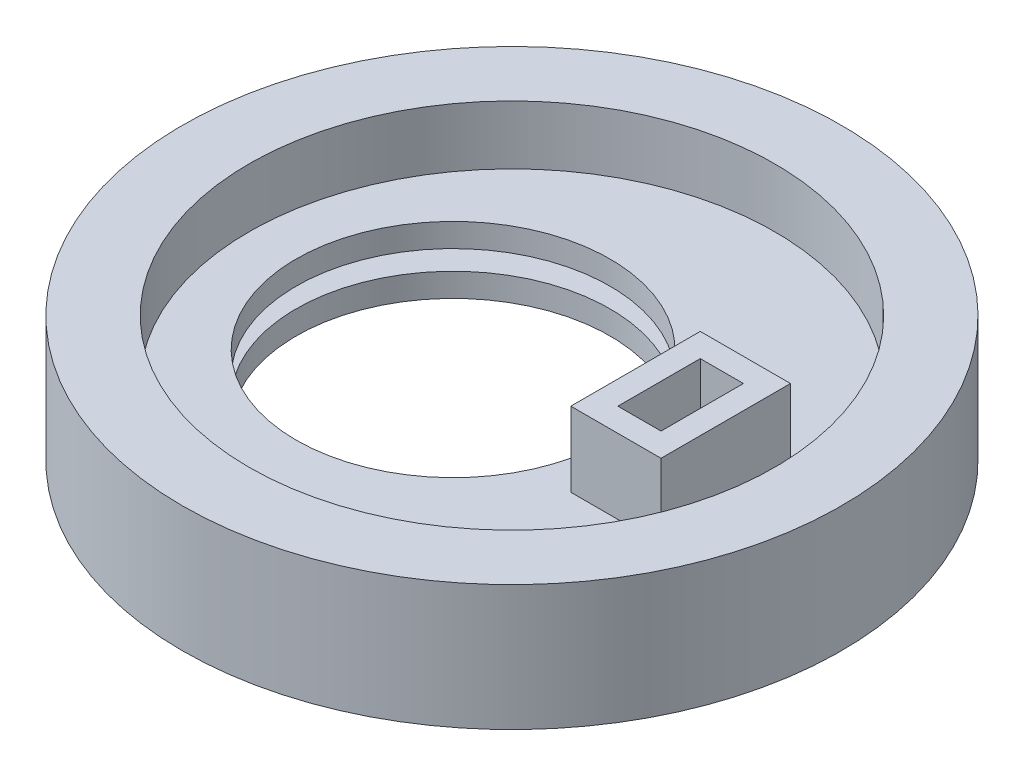
ISO-10303-21;
HEADER;
FILE_DESCRIPTION(('STEP AP214'),'2;1');
FILE_NAME('part.step','',(''),(''),'','','');
FILE_SCHEMA(('AUTOMOTIVE_DESIGN { 1 0 10303 214 1 1 1 1 }'));
ENDSEC;
DATA;
#1=APPLICATION_CONTEXT('core data for automotive mechanical design processes');
#2=APPLICATION_PROTOCOL_DEFINITION('international standard','automotive_design',2000,#1);
#3=PRODUCT_CONTEXT('',#1,'mechanical');
#4=PRODUCT('Part','Part','',(#3));
#5=PRODUCT_RELATED_PRODUCT_CATEGORY('part','',(#4));
#6=PRODUCT_DEFINITION_FORMATION('','',#4);
#7=PRODUCT_DEFINITION_CONTEXT('part definition',#1,'design');
#8=PRODUCT_DEFINITION('design','',#6,#7);
#9=PRODUCT_DEFINITION_SHAPE('','',#8);
#10=(LENGTH_UNIT() NAMED_UNIT(*) SI_UNIT(.MILLI.,.METRE.));
#11=(NAMED_UNIT(*) PLANE_ANGLE_UNIT() SI_UNIT($,.RADIAN.));
#12=(NAMED_UNIT(*) SI_UNIT($,.STERADIAN.) SOLID_ANGLE_UNIT());
#13=UNCERTAINTY_MEASURE_WITH_UNIT(LENGTH_MEASURE(1.E-05),#10,'distance_accuracy_value','');
#14=(GEOMETRIC_REPRESENTATION_CONTEXT(3) GLOBAL_UNCERTAINTY_ASSIGNED_CONTEXT((#13)) GLOBAL_UNIT_ASSIGNED_CONTEXT((#10,
#11,#12)) REPRESENTATION_CONTEXT('',''));
#15=CARTESIAN_POINT('',(0.,0.,0.));
#16=DIRECTION('',(0.,0.,1.));
#17=DIRECTION('',(1.,0.,0.));
#18=AXIS2_PLACEMENT_3D('',#15,#16,#17);
#19=CARTESIAN_POINT('',(0.,5.,0.));
#20=DIRECTION('',(0.,-1.,0.));
#21=DIRECTION('',(0.,0.,-1.));
#22=AXIS2_PLACEMENT_3D('',#19,#20,#21);
#23=PLANE('',#22);
#24=DIRECTION('',(0.,0.,-1.));
#25=VECTOR('',#24,1.);
#26=CARTESIAN_POINT('',(10.9,5.,0.));
#27=LINE('',#26,#25);
#28=CARTESIAN_POINT('',(10.9,5.,3.3));
#29=VERTEX_POINT('',#28);
#30=CARTESIAN_POINT('',(10.9,5.,-3.3));
#31=VERTEX_POINT('',#30);
#32=EDGE_CURVE('E111',#29,#31,#27,.T.);
#33=ORIENTED_EDGE('',*,*,#32,.T.);
#34=DIRECTION('',(-1.,0.,0.));
#35=VECTOR('',#34,1.);
#36=CARTESIAN_POINT('',(0.,5.,-3.3));
#37=LINE('',#36,#35);
#38=CARTESIAN_POINT('',(6.3,5.,-3.3));
#39=VERTEX_POINT('',#38);
#40=EDGE_CURVE('E89',#31,#39,#37,.T.);
#41=ORIENTED_EDGE('',*,*,#40,.T.);
#42=DIRECTION('',(0.,0.,1.));
#43=VECTOR('',#42,1.);
#44=CARTESIAN_POINT('',(6.3,5.,0.));
#45=LINE('',#44,#43);
#46=CARTESIAN_POINT('',(6.3,5.,3.3));
#47=VERTEX_POINT('',#46);
#48=EDGE_CURVE('E84',#39,#47,#45,.T.);
#49=ORIENTED_EDGE('',*,*,#48,.T.);
#50=DIRECTION('',(1.,0.,0.));
#51=VECTOR('',#50,1.);
#52=CARTESIAN_POINT('',(0.,5.,3.3));
#53=LINE('',#52,#51);
#54=EDGE_CURVE('E87',#47,#29,#53,.T.);
#55=ORIENTED_EDGE('',*,*,#54,.T.);
#56=EDGE_LOOP('',(#33,#41,#49,#55));
#57=FACE_BOUND('',#56,.T.);
#58=DIRECTION('',(0.,0.,-1.));
#59=VECTOR('',#58,1.);
#60=CARTESIAN_POINT('',(9.7,5.,-2.1));
#61=LINE('',#60,#59);
#62=CARTESIAN_POINT('',(9.7,5.,2.1));
#63=VERTEX_POINT('',#62);
#64=CARTESIAN_POINT('',(9.7,5.,-2.1));
#65=VERTEX_POINT('',#64);
#66=EDGE_CURVE('E179',#63,#65,#61,.T.);
#67=ORIENTED_EDGE('',*,*,#66,.F.);
#68=DIRECTION('',(1.,0.,0.));
#69=VECTOR('',#68,1.);
#70=CARTESIAN_POINT('',(9.7,5.,2.1));
#71=LINE('',#70,#69);
#72=CARTESIAN_POINT('',(7.5,5.,2.1));
#73=VERTEX_POINT('',#72);
#74=EDGE_CURVE('E174',#73,#63,#71,.T.);
#75=ORIENTED_EDGE('',*,*,#74,.F.);
#76=DIRECTION('',(0.,0.,1.));
#77=VECTOR('',#76,1.);
#78=CARTESIAN_POINT('',(7.5,5.,-2.1));
#79=LINE('',#78,#77);
#80=CARTESIAN_POINT('',(7.5,5.,-2.1));
#81=VERTEX_POINT('',#80);
#82=EDGE_CURVE('E195',#81,#73,#79,.T.);
#83=ORIENTED_EDGE('',*,*,#82,.F.);
#84=DIRECTION('',(-1.,0.,0.));
#85=VECTOR('',#84,1.);
#86=CARTESIAN_POINT('',(9.7,5.,-2.1));
#87=LINE('',#86,#85);
#88=EDGE_CURVE('E198',#65,#81,#87,.T.);
#89=ORIENTED_EDGE('',*,*,#88,.F.);
#90=EDGE_LOOP('',(#67,#75,#83,#89));
#91=FACE_BOUND('',#90,.T.);
#92=ADVANCED_FACE('F39',(#57,#91),#23,.F.);
#93=CARTESIAN_POINT('',(0.,1.2,0.));
#94=DIRECTION('',(0.,1.,0.));
#95=DIRECTION('',(0.,0.,1.));
#96=AXIS2_PLACEMENT_3D('',#93,#94,#95);
#97=PLANE('',#96);
#98=CARTESIAN_POINT('',(-3.,1.2,0.));
#99=DIRECTION('',(0.,1.,0.));
#100=DIRECTION('',(0.,0.,1.));
#101=AXIS2_PLACEMENT_3D('',#98,#99,#100);
#102=CIRCLE('',#101,8.);
#103=CARTESIAN_POINT('',(-3.,1.2,8.));
#104=VERTEX_POINT('',#103);
#105=EDGE_CURVE('E208',#104,#104,#102,.T.);
#106=ORIENTED_EDGE('',*,*,#105,.F.);
#107=EDGE_LOOP('',(#106));
#108=FACE_BOUND('',#107,.T.);
#109=CARTESIAN_POINT('',(0.,1.2,0.));
#110=DIRECTION('',(0.,1.,0.));
#111=DIRECTION('',(0.,0.,1.));
#112=AXIS2_PLACEMENT_3D('',#109,#110,#111);
#113=CIRCLE('',#112,13.4);
#114=CARTESIAN_POINT('',(0.,1.2,13.4));
#115=VERTEX_POINT('',#114);
#116=EDGE_CURVE('E121',#115,#115,#113,.T.);
#117=ORIENTED_EDGE('',*,*,#116,.T.);
#118=EDGE_LOOP('',(#117));
#119=FACE_BOUND('',#118,.T.);
#120=DIRECTION('',(-1.,0.,0.));
#121=VECTOR('',#120,1.);
#122=CARTESIAN_POINT('',(9.7,1.2,-3.3));
#123=LINE('',#122,#121);
#124=CARTESIAN_POINT('',(10.9,1.2,-3.3));
#125=VERTEX_POINT('',#124);
#126=CARTESIAN_POINT('',(6.3,1.2,-3.3));
#127=VERTEX_POINT('',#126);
#128=EDGE_CURVE('E131',#125,#127,#123,.T.);
#129=ORIENTED_EDGE('',*,*,#128,.F.);
#130=DIRECTION('',(0.,0.,-1.));
#131=VECTOR('',#130,1.);
#132=CARTESIAN_POINT('',(10.9,1.2,-2.1));
#133=LINE('',#132,#131);
#134=CARTESIAN_POINT('',(10.9,1.2,3.3));
#135=VERTEX_POINT('',#134);
#136=EDGE_CURVE('E134',#135,#125,#133,.T.);
#137=ORIENTED_EDGE('',*,*,#136,.F.);
#138=DIRECTION('',(1.,0.,0.));
#139=VECTOR('',#138,1.);
#140=CARTESIAN_POINT('',(9.7,1.2,3.3));
#141=LINE('',#140,#139);
#142=CARTESIAN_POINT('',(6.3,1.2,3.3));
#143=VERTEX_POINT('',#142);
#144=EDGE_CURVE('E113',#143,#135,#141,.T.);
#145=ORIENTED_EDGE('',*,*,#144,.F.);
#146=DIRECTION('',(0.,0.,1.));
#147=VECTOR('',#146,1.);
#148=CARTESIAN_POINT('',(6.3,1.2,-2.1));
#149=LINE('',#148,#147);
#150=EDGE_CURVE('E97',#127,#143,#149,.T.);
#151=ORIENTED_EDGE('',*,*,#150,.F.);
#152=EDGE_LOOP('',(#129,#137,#145,#151));
#153=FACE_BOUND('',#152,.T.);
#154=ADVANCED_FACE('F246',(#108,#119,#153),#97,.T.);
#155=CARTESIAN_POINT('',(0.,3.,0.));
#156=DIRECTION('',(0.,-1.,0.));
#157=DIRECTION('',(0.,0.,-1.));
#158=AXIS2_PLACEMENT_3D('',#155,#156,#157);
#159=CYLINDRICAL_SURFACE('',#158,16.8);
#160=CARTESIAN_POINT('',(0.,4.2,0.));
#161=DIRECTION('',(0.,1.,0.));
#162=DIRECTION('',(0.,0.,1.));
#163=AXIS2_PLACEMENT_3D('',#160,#161,#162);
#164=CIRCLE('',#163,16.8);
#165=CARTESIAN_POINT('',(0.,4.2,16.8));
#166=VERTEX_POINT('',#165);
#167=EDGE_CURVE('E11',#166,#166,#164,.T.);
#168=ORIENTED_EDGE('',*,*,#167,.F.);
#169=EDGE_LOOP('',(#168));
#170=FACE_BOUND('',#169,.T.);
#171=CARTESIAN_POINT('',(0.,-2.2,0.));
#172=DIRECTION('',(0.,1.,0.));
#173=DIRECTION('',(0.,0.,1.));
#174=AXIS2_PLACEMENT_3D('',#171,#172,#173);
#175=CIRCLE('',#174,16.8);
#176=CARTESIAN_POINT('',(0.,-2.2,16.8));
#177=VERTEX_POINT('',#176);
#178=EDGE_CURVE('E49',#177,#177,#175,.T.);
#179=ORIENTED_EDGE('',*,*,#178,.T.);
#180=EDGE_LOOP('',(#179));
#181=FACE_BOUND('',#180,.T.);
#182=ADVANCED_FACE('F251',(#170,#181),#159,.T.);
#183=CARTESIAN_POINT('',(0.,4.2,0.));
#184=DIRECTION('',(0.,1.,0.));
#185=DIRECTION('',(0.,0.,1.));
#186=AXIS2_PLACEMENT_3D('',#183,#184,#185);
#187=PLANE('',#186);
#188=CARTESIAN_POINT('',(0.,4.2,0.));
#189=DIRECTION('',(0.,1.,0.));
#190=DIRECTION('',(0.,0.,1.));
#191=AXIS2_PLACEMENT_3D('',#188,#189,#190);
#192=CIRCLE('',#191,13.4);
#193=CARTESIAN_POINT('',(0.,4.2,13.4));
#194=VERTEX_POINT('',#193);
#195=EDGE_CURVE('E124',#194,#194,#192,.T.);
#196=ORIENTED_EDGE('',*,*,#195,.F.);
#197=EDGE_LOOP('',(#196));
#198=FACE_BOUND('',#197,.T.);
#199=ORIENTED_EDGE('',*,*,#167,.T.);
#200=EDGE_LOOP('',(#199));
#201=FACE_BOUND('',#200,.T.);
#202=ADVANCED_FACE('F257',(#198,#201),#187,.T.);
#203=CARTESIAN_POINT('',(0.,-2.2,0.));
#204=DIRECTION('',(0.,1.,0.));
#205=DIRECTION('',(0.,0.,1.));
#206=AXIS2_PLACEMENT_3D('',#203,#204,#205);
#207=PLANE('',#206);
#208=CARTESIAN_POINT('',(-3.,-2.2,0.));
#209=DIRECTION('',(0.,1.,0.));
#210=DIRECTION('',(0.,0.,1.));
#211=AXIS2_PLACEMENT_3D('',#208,#209,#210);
#212=CIRCLE('',#211,8.);
#213=CARTESIAN_POINT('',(-3.,-2.2,8.));
#214=VERTEX_POINT('',#213);
#215=EDGE_CURVE('E212',#214,#214,#212,.T.);
#216=ORIENTED_EDGE('',*,*,#215,.T.);
#217=EDGE_LOOP('',(#216));
#218=FACE_BOUND('',#217,.T.);
#219=ORIENTED_EDGE('',*,*,#178,.F.);
#220=EDGE_LOOP('',(#219));
#221=FACE_BOUND('',#220,.T.);
#222=ADVANCED_FACE('F261',(#218,#221),#207,.F.);
#223=CARTESIAN_POINT('',(0.,3.,0.));
#224=DIRECTION('',(0.,-1.,0.));
#225=DIRECTION('',(0.,0.,-1.));
#226=AXIS2_PLACEMENT_3D('',#223,#224,#225);
#227=CYLINDRICAL_SURFACE('',#226,13.4);
#228=ORIENTED_EDGE('',*,*,#195,.T.);
#229=EDGE_LOOP('',(#228));
#230=FACE_BOUND('',#229,.T.);
#231=ORIENTED_EDGE('',*,*,#116,.F.);
#232=EDGE_LOOP('',(#231));
#233=FACE_BOUND('',#232,.T.);
#234=ADVANCED_FACE('F265',(#230,#233),#227,.F.);
#235=CARTESIAN_POINT('',(10.9,5.,-2.1));
#236=DIRECTION('',(-1.,0.,0.));
#237=DIRECTION('',(0.,0.,1.));
#238=AXIS2_PLACEMENT_3D('',#235,#236,#237);
#239=PLANE('',#238);
#240=ORIENTED_EDGE('',*,*,#136,.T.);
#241=DIRECTION('',(0.,-1.,0.));
#242=VECTOR('',#241,1.);
#243=CARTESIAN_POINT('',(10.9,5.,-3.3));
#244=LINE('',#243,#242);
#245=EDGE_CURVE('E116',#31,#125,#244,.T.);
#246=ORIENTED_EDGE('',*,*,#245,.F.);
#247=ORIENTED_EDGE('',*,*,#32,.F.);
#248=DIRECTION('',(0.,-1.,0.));
#249=VECTOR('',#248,1.);
#250=CARTESIAN_POINT('',(10.9,5.,3.3));
#251=LINE('',#250,#249);
#252=EDGE_CURVE('E101',#29,#135,#251,.T.);
#253=ORIENTED_EDGE('',*,*,#252,.T.);
#254=EDGE_LOOP('',(#240,#246,#247,#253));
#255=FACE_BOUND('',#254,.T.);
#256=ADVANCED_FACE('F268',(#255),#239,.F.);
#257=CARTESIAN_POINT('',(9.7,5.,-3.3));
#258=DIRECTION('',(0.,0.,1.));
#259=DIRECTION('',(1.,0.,0.));
#260=AXIS2_PLACEMENT_3D('',#257,#258,#259);
#261=PLANE('',#260);
#262=ORIENTED_EDGE('',*,*,#128,.T.);
#263=DIRECTION('',(0.,-1.,0.));
#264=VECTOR('',#263,1.);
#265=CARTESIAN_POINT('',(6.3,5.,-3.3));
#266=LINE('',#265,#264);
#267=EDGE_CURVE('E100',#39,#127,#266,.T.);
#268=ORIENTED_EDGE('',*,*,#267,.F.);
#269=ORIENTED_EDGE('',*,*,#40,.F.);
#270=ORIENTED_EDGE('',*,*,#245,.T.);
#271=EDGE_LOOP('',(#262,#268,#269,#270));
#272=FACE_BOUND('',#271,.T.);
#273=ADVANCED_FACE('F272',(#272),#261,.F.);
#274=CARTESIAN_POINT('',(6.3,5.,-2.1));
#275=DIRECTION('',(1.,0.,0.));
#276=DIRECTION('',(0.,0.,-1.));
#277=AXIS2_PLACEMENT_3D('',#274,#275,#276);
#278=PLANE('',#277);
#279=ORIENTED_EDGE('',*,*,#150,.T.);
#280=DIRECTION('',(0.,-1.,0.));
#281=VECTOR('',#280,1.);
#282=CARTESIAN_POINT('',(6.3,5.,3.3));
#283=LINE('',#282,#281);
#284=EDGE_CURVE('E66',#47,#143,#283,.T.);
#285=ORIENTED_EDGE('',*,*,#284,.F.);
#286=ORIENTED_EDGE('',*,*,#48,.F.);
#287=ORIENTED_EDGE('',*,*,#267,.T.);
#288=EDGE_LOOP('',(#279,#285,#286,#287));
#289=FACE_BOUND('',#288,.T.);
#290=ADVANCED_FACE('F95',(#289),#278,.F.);
#291=CARTESIAN_POINT('',(9.7,5.,3.3));
#292=DIRECTION('',(0.,0.,-1.));
#293=DIRECTION('',(-1.,0.,0.));
#294=AXIS2_PLACEMENT_3D('',#291,#292,#293);
#295=PLANE('',#294);
#296=ORIENTED_EDGE('',*,*,#144,.T.);
#297=ORIENTED_EDGE('',*,*,#252,.F.);
#298=ORIENTED_EDGE('',*,*,#54,.F.);
#299=ORIENTED_EDGE('',*,*,#284,.T.);
#300=EDGE_LOOP('',(#296,#297,#298,#299));
#301=FACE_BOUND('',#300,.T.);
#302=ADVANCED_FACE('F41',(#301),#295,.F.);
#303=CARTESIAN_POINT('',(0.,0.,0.));
#304=DIRECTION('',(0.,1.,0.));
#305=DIRECTION('',(0.,0.,1.));
#306=AXIS2_PLACEMENT_3D('',#303,#304,#305);
#307=PLANE('',#306);
#308=CARTESIAN_POINT('',(-3.,0.,0.));
#309=DIRECTION('',(0.,1.,0.));
#310=DIRECTION('',(0.,0.,1.));
#311=AXIS2_PLACEMENT_3D('',#308,#309,#310);
#312=CIRCLE('',#311,8.);
#313=CARTESIAN_POINT('',(-3.,0.,8.));
#314=VERTEX_POINT('',#313);
#315=EDGE_CURVE('E192',#314,#314,#312,.T.);
#316=ORIENTED_EDGE('',*,*,#315,.T.);
#317=EDGE_LOOP('',(#316));
#318=FACE_BOUND('',#317,.T.);
#319=CARTESIAN_POINT('',(0.,0.,0.));
#320=DIRECTION('',(0.,1.,0.));
#321=DIRECTION('',(0.,0.,1.));
#322=AXIS2_PLACEMENT_3D('',#319,#320,#321);
#323=CIRCLE('',#322,14.6);
#324=CARTESIAN_POINT('',(0.,0.,14.6));
#325=VERTEX_POINT('',#324);
#326=EDGE_CURVE('E153',#325,#325,#323,.T.);
#327=ORIENTED_EDGE('',*,*,#326,.F.);
#328=EDGE_LOOP('',(#327));
#329=FACE_BOUND('',#328,.T.);
#330=DIRECTION('',(-1.,0.,0.));
#331=VECTOR('',#330,1.);
#332=CARTESIAN_POINT('',(9.7,0.,-2.1));
#333=LINE('',#332,#331);
#334=CARTESIAN_POINT('',(9.7,0.,-2.1));
#335=VERTEX_POINT('',#334);
#336=CARTESIAN_POINT('',(7.5,0.,-2.1));
#337=VERTEX_POINT('',#336);
#338=EDGE_CURVE('E184',#335,#337,#333,.T.);
#339=ORIENTED_EDGE('',*,*,#338,.T.);
#340=DIRECTION('',(0.,0.,1.));
#341=VECTOR('',#340,1.);
#342=CARTESIAN_POINT('',(7.5,0.,-2.1));
#343=LINE('',#342,#341);
#344=CARTESIAN_POINT('',(7.5,0.,2.1));
#345=VERTEX_POINT('',#344);
#346=EDGE_CURVE('E180',#337,#345,#343,.T.);
#347=ORIENTED_EDGE('',*,*,#346,.T.);
#348=DIRECTION('',(1.,0.,0.));
#349=VECTOR('',#348,1.);
#350=CARTESIAN_POINT('',(9.7,0.,2.1));
#351=LINE('',#350,#349);
#352=CARTESIAN_POINT('',(9.7,0.,2.1));
#353=VERTEX_POINT('',#352);
#354=EDGE_CURVE('E175',#345,#353,#351,.T.);
#355=ORIENTED_EDGE('',*,*,#354,.T.);
#356=DIRECTION('',(0.,0.,-1.));
#357=VECTOR('',#356,1.);
#358=CARTESIAN_POINT('',(9.7,0.,-2.1));
#359=LINE('',#358,#357);
#360=EDGE_CURVE('E188',#353,#335,#359,.T.);
#361=ORIENTED_EDGE('',*,*,#360,.T.);
#362=EDGE_LOOP('',(#339,#347,#355,#361));
#363=FACE_BOUND('',#362,.T.);
#364=ADVANCED_FACE('F234',(#318,#329,#363),#307,.F.);
#365=CARTESIAN_POINT('',(0.,3.,0.));
#366=DIRECTION('',(0.,-1.,0.));
#367=DIRECTION('',(0.,0.,-1.));
#368=AXIS2_PLACEMENT_3D('',#365,#366,#367);
#369=CYLINDRICAL_SURFACE('',#368,15.6);
#370=CARTESIAN_POINT('',(0.,3.,0.));
#371=DIRECTION('',(0.,1.,0.));
#372=DIRECTION('',(0.,0.,1.));
#373=AXIS2_PLACEMENT_3D('',#370,#371,#372);
#374=CIRCLE('',#373,15.6);
#375=CARTESIAN_POINT('',(0.,3.,15.6));
#376=VERTEX_POINT('',#375);
#377=EDGE_CURVE('E138',#376,#376,#374,.T.);
#378=ORIENTED_EDGE('',*,*,#377,.T.);
#379=EDGE_LOOP('',(#378));
#380=FACE_BOUND('',#379,.T.);
#381=CARTESIAN_POINT('',(0.,-1.,0.));
#382=DIRECTION('',(0.,1.,0.));
#383=DIRECTION('',(0.,0.,1.));
#384=AXIS2_PLACEMENT_3D('',#381,#382,#383);
#385=CIRCLE('',#384,15.6);
#386=CARTESIAN_POINT('',(0.,-1.,15.6));
#387=VERTEX_POINT('',#386);
#388=EDGE_CURVE('E148',#387,#387,#385,.T.);
#389=ORIENTED_EDGE('',*,*,#388,.F.);
#390=EDGE_LOOP('',(#389));
#391=FACE_BOUND('',#390,.T.);
#392=ADVANCED_FACE('F232',(#380,#391),#369,.F.);
#393=CARTESIAN_POINT('',(0.,3.,0.));
#394=DIRECTION('',(0.,1.,0.));
#395=DIRECTION('',(0.,0.,1.));
#396=AXIS2_PLACEMENT_3D('',#393,#394,#395);
#397=PLANE('',#396);
#398=CARTESIAN_POINT('',(0.,3.,0.));
#399=DIRECTION('',(0.,1.,0.));
#400=DIRECTION('',(0.,0.,1.));
#401=AXIS2_PLACEMENT_3D('',#398,#399,#400);
#402=CIRCLE('',#401,14.6);
#403=CARTESIAN_POINT('',(0.,3.,14.6));
#404=VERTEX_POINT('',#403);
#405=EDGE_CURVE('E152',#404,#404,#402,.T.);
#406=ORIENTED_EDGE('',*,*,#405,.T.);
#407=EDGE_LOOP('',(#406));
#408=FACE_BOUND('',#407,.T.);
#409=ORIENTED_EDGE('',*,*,#377,.F.);
#410=EDGE_LOOP('',(#409));
#411=FACE_BOUND('',#410,.T.);
#412=ADVANCED_FACE('F228',(#408,#411),#397,.F.);
#413=CARTESIAN_POINT('',(0.,-1.,0.));
#414=DIRECTION('',(0.,1.,0.));
#415=DIRECTION('',(0.,0.,1.));
#416=AXIS2_PLACEMENT_3D('',#413,#414,#415);
#417=PLANE('',#416);
#418=CARTESIAN_POINT('',(-3.,-1.,0.));
#419=DIRECTION('',(0.,1.,0.));
#420=DIRECTION('',(0.,0.,1.));
#421=AXIS2_PLACEMENT_3D('',#418,#419,#420);
#422=CIRCLE('',#421,8.);
#423=CARTESIAN_POINT('',(-3.,-1.,8.));
#424=VERTEX_POINT('',#423);
#425=EDGE_CURVE('E43',#424,#424,#422,.T.);
#426=ORIENTED_EDGE('',*,*,#425,.F.);
#427=EDGE_LOOP('',(#426));
#428=FACE_BOUND('',#427,.T.);
#429=ORIENTED_EDGE('',*,*,#388,.T.);
#430=EDGE_LOOP('',(#429));
#431=FACE_BOUND('',#430,.T.);
#432=ADVANCED_FACE('F224',(#428,#431),#417,.T.);
#433=CARTESIAN_POINT('',(0.,3.,0.));
#434=DIRECTION('',(0.,-1.,0.));
#435=DIRECTION('',(0.,0.,-1.));
#436=AXIS2_PLACEMENT_3D('',#433,#434,#435);
#437=CYLINDRICAL_SURFACE('',#436,14.6);
#438=ORIENTED_EDGE('',*,*,#405,.F.);
#439=EDGE_LOOP('',(#438));
#440=FACE_BOUND('',#439,.T.);
#441=ORIENTED_EDGE('',*,*,#326,.T.);
#442=EDGE_LOOP('',(#441));
#443=FACE_BOUND('',#442,.T.);
#444=ADVANCED_FACE('F227',(#440,#443),#437,.T.);
#445=CARTESIAN_POINT('',(9.7,5.,-2.1));
#446=DIRECTION('',(-1.,0.,0.));
#447=DIRECTION('',(0.,0.,1.));
#448=AXIS2_PLACEMENT_3D('',#445,#446,#447);
#449=PLANE('',#448);
#450=ORIENTED_EDGE('',*,*,#360,.F.);
#451=DIRECTION('',(0.,-1.,0.));
#452=VECTOR('',#451,1.);
#453=CARTESIAN_POINT('',(9.7,5.,2.1));
#454=LINE('',#453,#452);
#455=EDGE_CURVE('E170',#63,#353,#454,.T.);
#456=ORIENTED_EDGE('',*,*,#455,.F.);
#457=ORIENTED_EDGE('',*,*,#66,.T.);
#458=DIRECTION('',(0.,-1.,0.));
#459=VECTOR('',#458,1.);
#460=CARTESIAN_POINT('',(9.7,5.,-2.1));
#461=LINE('',#460,#459);
#462=EDGE_CURVE('E157',#65,#335,#461,.T.);
#463=ORIENTED_EDGE('',*,*,#462,.T.);
#464=EDGE_LOOP('',(#450,#456,#457,#463));
#465=FACE_BOUND('',#464,.T.);
#466=ADVANCED_FACE('F334',(#465),#449,.T.);
#467=CARTESIAN_POINT('',(9.7,5.,-2.1));
#468=DIRECTION('',(0.,0.,1.));
#469=DIRECTION('',(1.,0.,0.));
#470=AXIS2_PLACEMENT_3D('',#467,#468,#469);
#471=PLANE('',#470);
#472=ORIENTED_EDGE('',*,*,#338,.F.);
#473=ORIENTED_EDGE('',*,*,#462,.F.);
#474=ORIENTED_EDGE('',*,*,#88,.T.);
#475=DIRECTION('',(0.,-1.,0.));
#476=VECTOR('',#475,1.);
#477=CARTESIAN_POINT('',(7.5,5.,-2.1));
#478=LINE('',#477,#476);
#479=EDGE_CURVE('E164',#81,#337,#478,.T.);
#480=ORIENTED_EDGE('',*,*,#479,.T.);
#481=EDGE_LOOP('',(#472,#473,#474,#480));
#482=FACE_BOUND('',#481,.T.);
#483=ADVANCED_FACE('F330',(#482),#471,.T.);
#484=CARTESIAN_POINT('',(7.5,5.,-2.1));
#485=DIRECTION('',(1.,0.,0.));
#486=DIRECTION('',(0.,0.,-1.));
#487=AXIS2_PLACEMENT_3D('',#484,#485,#486);
#488=PLANE('',#487);
#489=ORIENTED_EDGE('',*,*,#346,.F.);
#490=ORIENTED_EDGE('',*,*,#479,.F.);
#491=ORIENTED_EDGE('',*,*,#82,.T.);
#492=DIRECTION('',(0.,-1.,0.));
#493=VECTOR('',#492,1.);
#494=CARTESIAN_POINT('',(7.5,5.,2.1));
#495=LINE('',#494,#493);
#496=EDGE_CURVE('E57',#73,#345,#495,.T.);
#497=ORIENTED_EDGE('',*,*,#496,.T.);
#498=EDGE_LOOP('',(#489,#490,#491,#497));
#499=FACE_BOUND('',#498,.T.);
#500=ADVANCED_FACE('F327',(#499),#488,.T.);
#501=CARTESIAN_POINT('',(9.7,5.,2.1));
#502=DIRECTION('',(0.,0.,-1.));
#503=DIRECTION('',(-1.,0.,0.));
#504=AXIS2_PLACEMENT_3D('',#501,#502,#503);
#505=PLANE('',#504);
#506=ORIENTED_EDGE('',*,*,#354,.F.);
#507=ORIENTED_EDGE('',*,*,#496,.F.);
#508=ORIENTED_EDGE('',*,*,#74,.T.);
#509=ORIENTED_EDGE('',*,*,#455,.T.);
#510=EDGE_LOOP('',(#506,#507,#508,#509));
#511=FACE_BOUND('',#510,.T.);
#512=ADVANCED_FACE('F311',(#511),#505,.T.);
#513=CARTESIAN_POINT('',(-3.,-2.2,0.));
#514=DIRECTION('',(0.,1.,0.));
#515=DIRECTION('',(0.,0.,1.));
#516=AXIS2_PLACEMENT_3D('',#513,#514,#515);
#517=CYLINDRICAL_SURFACE('',#516,8.);
#518=ORIENTED_EDGE('',*,*,#425,.T.);
#519=EDGE_LOOP('',(#518));
#520=FACE_BOUND('',#519,.T.);
#521=ORIENTED_EDGE('',*,*,#215,.F.);
#522=EDGE_LOOP('',(#521));
#523=FACE_BOUND('',#522,.T.);
#524=ADVANCED_FACE('F221',(#520,#523),#517,.F.);
#525=ORIENTED_EDGE('',*,*,#105,.T.);
#526=EDGE_LOOP('',(#525));
#527=FACE_BOUND('',#526,.T.);
#528=ORIENTED_EDGE('',*,*,#315,.F.);
#529=EDGE_LOOP('',(#528));
#530=FACE_BOUND('',#529,.T.);
#531=ADVANCED_FACE('F310',(#527,#530),#517,.F.);
#532=CLOSED_SHELL('',(#92,#154,#182,#202,#222,#234,#256,#273,#290,#302,#364,#392,#412,#432,#444,
#466,#483,#500,#512,#524,#531));
#533=MANIFOLD_SOLID_BREP('B2',#532);
#534=ADVANCED_BREP_SHAPE_REPRESENTATION('',(#18,#533),#14);
#535=SHAPE_DEFINITION_REPRESENTATION(#9,#534);
ENDSEC;
END-ISO-10303-21;
